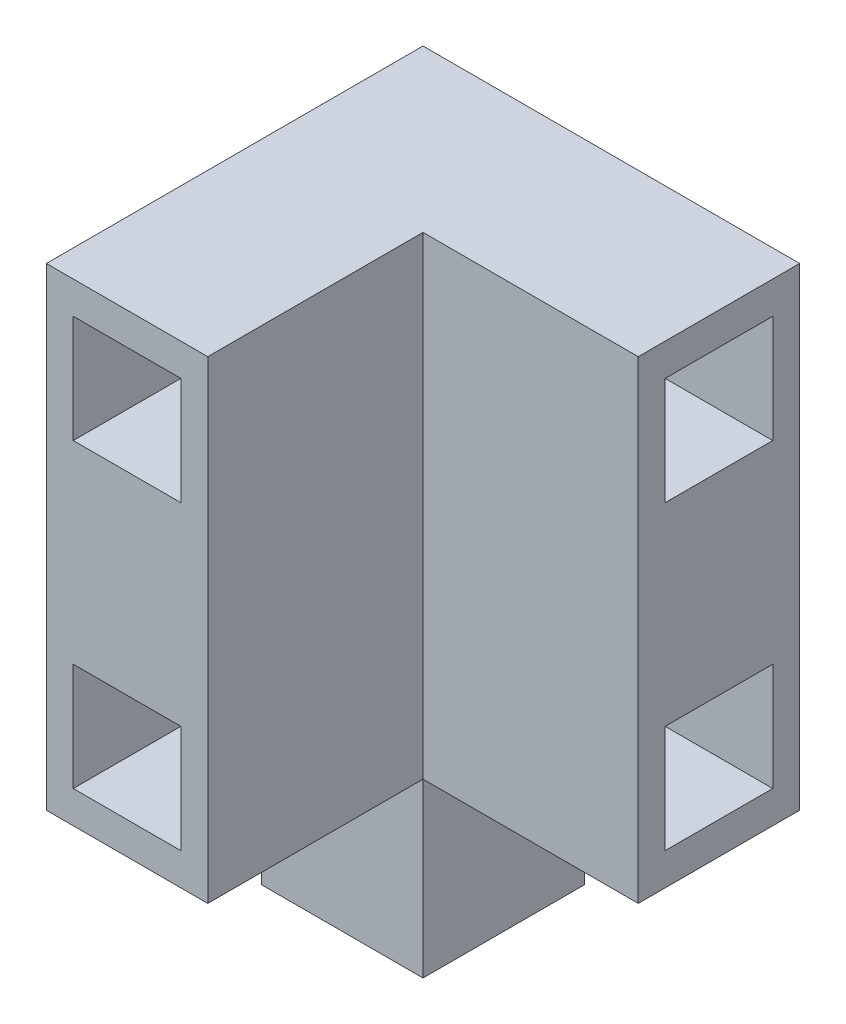
ISO-10303-21;
HEADER;
FILE_DESCRIPTION(('STEP AP214'),'2;1');
FILE_NAME('part.step','',(''),(''),'','','');
FILE_SCHEMA(('AUTOMOTIVE_DESIGN { 1 0 10303 214 1 1 1 1 }'));
ENDSEC;
DATA;
#1=APPLICATION_CONTEXT('core data for automotive mechanical design processes');
#2=APPLICATION_PROTOCOL_DEFINITION('international standard','automotive_design',2000,#1);
#3=PRODUCT_CONTEXT('',#1,'mechanical');
#4=PRODUCT('Part','Part','',(#3));
#5=PRODUCT_RELATED_PRODUCT_CATEGORY('part','',(#4));
#6=PRODUCT_DEFINITION_FORMATION('','',#4);
#7=PRODUCT_DEFINITION_CONTEXT('part definition',#1,'design');
#8=PRODUCT_DEFINITION('design','',#6,#7);
#9=PRODUCT_DEFINITION_SHAPE('','',#8);
#10=(LENGTH_UNIT() NAMED_UNIT(*) SI_UNIT(.MILLI.,.METRE.));
#11=(NAMED_UNIT(*) PLANE_ANGLE_UNIT() SI_UNIT($,.RADIAN.));
#12=(NAMED_UNIT(*) SI_UNIT($,.STERADIAN.) SOLID_ANGLE_UNIT());
#13=UNCERTAINTY_MEASURE_WITH_UNIT(LENGTH_MEASURE(1.E-05),#10,'distance_accuracy_value','');
#14=(GEOMETRIC_REPRESENTATION_CONTEXT(3) GLOBAL_UNCERTAINTY_ASSIGNED_CONTEXT((#13)) GLOBAL_UNIT_ASSIGNED_CONTEXT((#10,
#11,#12)) REPRESENTATION_CONTEXT('',''));
#15=CARTESIAN_POINT('',(0.,0.,0.));
#16=DIRECTION('',(0.,0.,1.));
#17=DIRECTION('',(1.,0.,0.));
#18=AXIS2_PLACEMENT_3D('',#15,#16,#17);
#19=CARTESIAN_POINT('',(5.,19.,-42.5));
#20=DIRECTION('',(1.,0.,0.));
#21=DIRECTION('',(0.,0.,-1.));
#22=AXIS2_PLACEMENT_3D('',#19,#20,#21);
#23=PLANE('',#22);
#24=DIRECTION('',(0.,0.,1.));
#25=VECTOR('',#24,1.);
#26=CARTESIAN_POINT('',(5.,19.,-42.5));
#27=LINE('',#26,#25);
#28=CARTESIAN_POINT('',(5.,19.,-7.5));
#29=VERTEX_POINT('',#28);
#30=CARTESIAN_POINT('',(5.,19.,-5.));
#31=VERTEX_POINT('',#30);
#32=EDGE_CURVE('E401',#29,#31,#27,.T.);
#33=ORIENTED_EDGE('',*,*,#32,.T.);
#34=DIRECTION('',(0.,1.,0.));
#35=VECTOR('',#34,1.);
#36=CARTESIAN_POINT('',(5.,19.,-5.));
#37=LINE('',#36,#35);
#38=CARTESIAN_POINT('',(5.,29.,-5.));
#39=VERTEX_POINT('',#38);
#40=EDGE_CURVE('E346',#31,#39,#37,.T.);
#41=ORIENTED_EDGE('',*,*,#40,.T.);
#42=DIRECTION('',(0.,0.,1.));
#43=VECTOR('',#42,1.);
#44=CARTESIAN_POINT('',(5.,29.,-42.5));
#45=LINE('',#44,#43);
#46=CARTESIAN_POINT('',(5.,29.,-7.5));
#47=VERTEX_POINT('',#46);
#48=EDGE_CURVE('E388',#47,#39,#45,.T.);
#49=ORIENTED_EDGE('',*,*,#48,.F.);
#50=DIRECTION('',(0.,1.,0.));
#51=VECTOR('',#50,1.);
#52=CARTESIAN_POINT('',(5.,60.,-7.5));
#53=LINE('',#52,#51);
#54=EDGE_CURVE('E422',#29,#47,#53,.T.);
#55=ORIENTED_EDGE('',*,*,#54,.F.);
#56=EDGE_LOOP('',(#33,#41,#49,#55));
#57=FACE_BOUND('',#56,.T.);
#58=ADVANCED_FACE('F42',(#57),#23,.F.);
#59=CARTESIAN_POINT('',(-5.,19.,-42.5));
#60=DIRECTION('',(-1.,0.,0.));
#61=DIRECTION('',(0.,0.,1.));
#62=AXIS2_PLACEMENT_3D('',#59,#60,#61);
#63=PLANE('',#62);
#64=DIRECTION('',(0.,0.,1.));
#65=VECTOR('',#64,1.);
#66=CARTESIAN_POINT('',(-5.,29.,-42.5));
#67=LINE('',#66,#65);
#68=CARTESIAN_POINT('',(-5.,29.,-7.5));
#69=VERTEX_POINT('',#68);
#70=CARTESIAN_POINT('',(-5.,29.,-5.));
#71=VERTEX_POINT('',#70);
#72=EDGE_CURVE('E393',#69,#71,#67,.T.);
#73=ORIENTED_EDGE('',*,*,#72,.T.);
#74=DIRECTION('',(0.,-1.,0.));
#75=VECTOR('',#74,1.);
#76=CARTESIAN_POINT('',(-5.,19.,-5.));
#77=LINE('',#76,#75);
#78=CARTESIAN_POINT('',(-5.,19.,-5.));
#79=VERTEX_POINT('',#78);
#80=EDGE_CURVE('E343',#71,#79,#77,.T.);
#81=ORIENTED_EDGE('',*,*,#80,.T.);
#82=DIRECTION('',(0.,0.,1.));
#83=VECTOR('',#82,1.);
#84=CARTESIAN_POINT('',(-5.,19.,-42.5));
#85=LINE('',#84,#83);
#86=CARTESIAN_POINT('',(-5.,19.,-7.5));
#87=VERTEX_POINT('',#86);
#88=EDGE_CURVE('E397',#87,#79,#85,.T.);
#89=ORIENTED_EDGE('',*,*,#88,.F.);
#90=DIRECTION('',(0.,-1.,0.));
#91=VECTOR('',#90,1.);
#92=CARTESIAN_POINT('',(-5.,60.,-7.5));
#93=LINE('',#92,#91);
#94=EDGE_CURVE('E416',#69,#87,#93,.T.);
#95=ORIENTED_EDGE('',*,*,#94,.F.);
#96=EDGE_LOOP('',(#73,#81,#89,#95));
#97=FACE_BOUND('',#96,.T.);
#98=ADVANCED_FACE('F554',(#97),#63,.F.);
#99=CARTESIAN_POINT('',(5.,47.,-42.5));
#100=DIRECTION('',(1.,0.,0.));
#101=DIRECTION('',(0.,0.,-1.));
#102=AXIS2_PLACEMENT_3D('',#99,#100,#101);
#103=PLANE('',#102);
#104=DIRECTION('',(0.,0.,1.));
#105=VECTOR('',#104,1.);
#106=CARTESIAN_POINT('',(5.,47.,-42.5));
#107=LINE('',#106,#105);
#108=CARTESIAN_POINT('',(5.,47.,-7.5));
#109=VERTEX_POINT('',#108);
#110=CARTESIAN_POINT('',(5.,47.,-5.));
#111=VERTEX_POINT('',#110);
#112=EDGE_CURVE('E373',#109,#111,#107,.T.);
#113=ORIENTED_EDGE('',*,*,#112,.T.);
#114=DIRECTION('',(0.,1.,0.));
#115=VECTOR('',#114,1.);
#116=CARTESIAN_POINT('',(5.,47.,-5.));
#117=LINE('',#116,#115);
#118=CARTESIAN_POINT('',(5.,57.,-5.));
#119=VERTEX_POINT('',#118);
#120=EDGE_CURVE('E322',#111,#119,#117,.T.);
#121=ORIENTED_EDGE('',*,*,#120,.T.);
#122=DIRECTION('',(0.,0.,1.));
#123=VECTOR('',#122,1.);
#124=CARTESIAN_POINT('',(5.,57.,-42.5));
#125=LINE('',#124,#123);
#126=CARTESIAN_POINT('',(5.,57.,-7.5));
#127=VERTEX_POINT('',#126);
#128=EDGE_CURVE('E386',#127,#119,#125,.T.);
#129=ORIENTED_EDGE('',*,*,#128,.F.);
#130=DIRECTION('',(0.,1.,0.));
#131=VECTOR('',#130,1.);
#132=CARTESIAN_POINT('',(5.,60.,-7.5));
#133=LINE('',#132,#131);
#134=EDGE_CURVE('E434',#109,#127,#133,.T.);
#135=ORIENTED_EDGE('',*,*,#134,.F.);
#136=EDGE_LOOP('',(#113,#121,#129,#135));
#137=FACE_BOUND('',#136,.T.);
#138=ADVANCED_FACE('F562',(#137),#103,.F.);
#139=CARTESIAN_POINT('',(-5.,47.,-42.5));
#140=DIRECTION('',(-1.,0.,0.));
#141=DIRECTION('',(0.,0.,1.));
#142=AXIS2_PLACEMENT_3D('',#139,#140,#141);
#143=PLANE('',#142);
#144=DIRECTION('',(0.,0.,1.));
#145=VECTOR('',#144,1.);
#146=CARTESIAN_POINT('',(-5.,57.,-42.5));
#147=LINE('',#146,#145);
#148=CARTESIAN_POINT('',(-5.,57.,-7.5));
#149=VERTEX_POINT('',#148);
#150=CARTESIAN_POINT('',(-5.,57.,-5.));
#151=VERTEX_POINT('',#150);
#152=EDGE_CURVE('E382',#149,#151,#147,.T.);
#153=ORIENTED_EDGE('',*,*,#152,.T.);
#154=DIRECTION('',(0.,-1.,0.));
#155=VECTOR('',#154,1.);
#156=CARTESIAN_POINT('',(-5.,47.,-5.));
#157=LINE('',#156,#155);
#158=CARTESIAN_POINT('',(-5.,47.,-5.));
#159=VERTEX_POINT('',#158);
#160=EDGE_CURVE('E319',#151,#159,#157,.T.);
#161=ORIENTED_EDGE('',*,*,#160,.T.);
#162=DIRECTION('',(0.,0.,1.));
#163=VECTOR('',#162,1.);
#164=CARTESIAN_POINT('',(-5.,47.,-42.5));
#165=LINE('',#164,#163);
#166=CARTESIAN_POINT('',(-5.,47.,-7.5));
#167=VERTEX_POINT('',#166);
#168=EDGE_CURVE('E378',#167,#159,#165,.T.);
#169=ORIENTED_EDGE('',*,*,#168,.F.);
#170=DIRECTION('',(0.,-1.,0.));
#171=VECTOR('',#170,1.);
#172=CARTESIAN_POINT('',(-5.,60.,-7.5));
#173=LINE('',#172,#171);
#174=EDGE_CURVE('E428',#149,#167,#173,.T.);
#175=ORIENTED_EDGE('',*,*,#174,.F.);
#176=EDGE_LOOP('',(#153,#161,#169,#175));
#177=FACE_BOUND('',#176,.T.);
#178=ADVANCED_FACE('F552',(#177),#143,.F.);
#179=CARTESIAN_POINT('',(7.5,60.,-7.5));
#180=DIRECTION('',(-1.,0.,0.));
#181=DIRECTION('',(0.,0.,1.));
#182=AXIS2_PLACEMENT_3D('',#179,#180,#181);
#183=PLANE('',#182);
#184=DIRECTION('',(0.,0.,-1.));
#185=VECTOR('',#184,1.);
#186=CARTESIAN_POINT('',(7.5,16.,-7.50000000000001));
#187=LINE('',#186,#185);
#188=CARTESIAN_POINT('',(7.5,16.,7.5));
#189=VERTEX_POINT('',#188);
#190=CARTESIAN_POINT('',(7.5,16.,-7.5));
#191=VERTEX_POINT('',#190);
#192=EDGE_CURVE('E442',#189,#191,#187,.T.);
#193=ORIENTED_EDGE('',*,*,#192,.F.);
#194=DIRECTION('',(0.,-1.,0.));
#195=VECTOR('',#194,1.);
#196=CARTESIAN_POINT('',(7.5,60.,7.5));
#197=LINE('',#196,#195);
#198=CARTESIAN_POINT('',(7.5,0.,7.5));
#199=VERTEX_POINT('',#198);
#200=EDGE_CURVE('E489',#189,#199,#197,.T.);
#201=ORIENTED_EDGE('',*,*,#200,.T.);
#202=DIRECTION('',(0.,0.,-1.));
#203=VECTOR('',#202,1.);
#204=CARTESIAN_POINT('',(7.5,0.,-7.5));
#205=LINE('',#204,#203);
#206=CARTESIAN_POINT('',(7.5,0.,-7.5));
#207=VERTEX_POINT('',#206);
#208=EDGE_CURVE('E480',#199,#207,#205,.T.);
#209=ORIENTED_EDGE('',*,*,#208,.T.);
#210=DIRECTION('',(0.,-1.,0.));
#211=VECTOR('',#210,1.);
#212=CARTESIAN_POINT('',(7.5,60.,-7.5));
#213=LINE('',#212,#211);
#214=EDGE_CURVE('E11',#191,#207,#213,.T.);
#215=ORIENTED_EDGE('',*,*,#214,.F.);
#216=EDGE_LOOP('',(#193,#201,#209,#215));
#217=FACE_BOUND('',#216,.T.);
#218=ADVANCED_FACE('F44',(#217),#183,.F.);
#219=DIRECTION('',(0.,-1.,0.));
#220=VECTOR('',#219,1.);
#221=CARTESIAN_POINT('',(7.5,60.,7.5));
#222=LINE('',#221,#220);
#223=CARTESIAN_POINT('',(7.5,60.,7.5));
#224=VERTEX_POINT('',#223);
#225=EDGE_CURVE('E437',#224,#189,#222,.T.);
#226=ORIENTED_EDGE('',*,*,#225,.F.);
#227=DIRECTION('',(0.,0.,-1.));
#228=VECTOR('',#227,1.);
#229=CARTESIAN_POINT('',(7.5,60.,-7.5));
#230=LINE('',#229,#228);
#231=CARTESIAN_POINT('',(7.5,60.,27.5));
#232=VERTEX_POINT('',#231);
#233=EDGE_CURVE('E481',#232,#224,#230,.T.);
#234=ORIENTED_EDGE('',*,*,#233,.F.);
#235=DIRECTION('',(0.,1.,0.));
#236=VECTOR('',#235,1.);
#237=CARTESIAN_POINT('',(7.5,60.,27.5));
#238=LINE('',#237,#236);
#239=CARTESIAN_POINT('',(7.5,16.,27.5));
#240=VERTEX_POINT('',#239);
#241=EDGE_CURVE('E467',#240,#232,#238,.T.);
#242=ORIENTED_EDGE('',*,*,#241,.F.);
#243=DIRECTION('',(0.,0.,-1.));
#244=VECTOR('',#243,1.);
#245=CARTESIAN_POINT('',(7.5,16.,27.5));
#246=LINE('',#245,#244);
#247=EDGE_CURVE('E473',#240,#189,#246,.T.);
#248=ORIENTED_EDGE('',*,*,#247,.T.);
#249=EDGE_LOOP('',(#226,#234,#242,#248));
#250=FACE_BOUND('',#249,.T.);
#251=ADVANCED_FACE('F544',(#250),#183,.F.);
#252=CARTESIAN_POINT('',(-7.5,60.,7.5));
#253=DIRECTION('',(0.,0.,-1.));
#254=DIRECTION('',(-1.,0.,0.));
#255=AXIS2_PLACEMENT_3D('',#252,#253,#254);
#256=PLANE('',#255);
#257=DIRECTION('',(1.,0.,0.));
#258=VECTOR('',#257,1.);
#259=CARTESIAN_POINT('',(-7.49999999999999,16.,7.5));
#260=LINE('',#259,#258);
#261=CARTESIAN_POINT('',(-7.5,16.,7.5));
#262=VERTEX_POINT('',#261);
#263=EDGE_CURVE('E461',#262,#189,#260,.T.);
#264=ORIENTED_EDGE('',*,*,#263,.F.);
#265=DIRECTION('',(0.,-1.,0.));
#266=VECTOR('',#265,1.);
#267=CARTESIAN_POINT('',(-7.5,60.,7.5));
#268=LINE('',#267,#266);
#269=CARTESIAN_POINT('',(-7.5,0.,7.5));
#270=VERTEX_POINT('',#269);
#271=EDGE_CURVE('E500',#262,#270,#268,.T.);
#272=ORIENTED_EDGE('',*,*,#271,.T.);
#273=DIRECTION('',(1.,0.,0.));
#274=VECTOR('',#273,1.);
#275=CARTESIAN_POINT('',(-7.5,0.,7.5));
#276=LINE('',#275,#274);
#277=EDGE_CURVE('E485',#270,#199,#276,.T.);
#278=ORIENTED_EDGE('',*,*,#277,.T.);
#279=ORIENTED_EDGE('',*,*,#200,.F.);
#280=EDGE_LOOP('',(#264,#272,#278,#279));
#281=FACE_BOUND('',#280,.T.);
#282=ADVANCED_FACE('F517',(#281),#256,.F.);
#283=CARTESIAN_POINT('',(-7.5,60.,-7.5));
#284=DIRECTION('',(0.,0.,1.));
#285=DIRECTION('',(1.,0.,0.));
#286=AXIS2_PLACEMENT_3D('',#283,#284,#285);
#287=PLANE('',#286);
#288=DIRECTION('',(1.,0.,0.));
#289=VECTOR('',#288,1.);
#290=CARTESIAN_POINT('',(-7.5,47.,-7.5));
#291=LINE('',#290,#289);
#292=EDGE_CURVE('E431',#167,#109,#291,.T.);
#293=ORIENTED_EDGE('',*,*,#292,.T.);
#294=ORIENTED_EDGE('',*,*,#134,.T.);
#295=DIRECTION('',(-1.,0.,0.));
#296=VECTOR('',#295,1.);
#297=CARTESIAN_POINT('',(-7.5,57.,-7.5));
#298=LINE('',#297,#296);
#299=EDGE_CURVE('E425',#127,#149,#298,.T.);
#300=ORIENTED_EDGE('',*,*,#299,.T.);
#301=ORIENTED_EDGE('',*,*,#174,.T.);
#302=EDGE_LOOP('',(#293,#294,#300,#301));
#303=FACE_BOUND('',#302,.T.);
#304=DIRECTION('',(1.,0.,0.));
#305=VECTOR('',#304,1.);
#306=CARTESIAN_POINT('',(-7.5,19.,-7.5));
#307=LINE('',#306,#305);
#308=EDGE_CURVE('E419',#87,#29,#307,.T.);
#309=ORIENTED_EDGE('',*,*,#308,.T.);
#310=ORIENTED_EDGE('',*,*,#54,.T.);
#311=DIRECTION('',(-1.,0.,0.));
#312=VECTOR('',#311,1.);
#313=CARTESIAN_POINT('',(-7.5,29.,-7.5));
#314=LINE('',#313,#312);
#315=EDGE_CURVE('E376',#47,#69,#314,.T.);
#316=ORIENTED_EDGE('',*,*,#315,.T.);
#317=ORIENTED_EDGE('',*,*,#94,.T.);
#318=EDGE_LOOP('',(#309,#310,#316,#317));
#319=FACE_BOUND('',#318,.T.);
#320=DIRECTION('',(-1.,0.,0.));
#321=VECTOR('',#320,1.);
#322=CARTESIAN_POINT('',(-7.5,0.,-7.5));
#323=LINE('',#322,#321);
#324=CARTESIAN_POINT('',(-7.5,0.,-7.5));
#325=VERTEX_POINT('',#324);
#326=EDGE_CURVE('E492',#207,#325,#323,.T.);
#327=ORIENTED_EDGE('',*,*,#326,.T.);
#328=DIRECTION('',(0.,-1.,0.));
#329=VECTOR('',#328,1.);
#330=CARTESIAN_POINT('',(-7.5,60.,-7.5));
#331=LINE('',#330,#329);
#332=CARTESIAN_POINT('',(-7.5,60.,-7.5));
#333=VERTEX_POINT('',#332);
#334=EDGE_CURVE('E50',#333,#325,#331,.T.);
#335=ORIENTED_EDGE('',*,*,#334,.F.);
#336=DIRECTION('',(-1.,0.,0.));
#337=VECTOR('',#336,1.);
#338=CARTESIAN_POINT('',(-7.5,60.,-7.5));
#339=LINE('',#338,#337);
#340=CARTESIAN_POINT('',(27.5,60.,-7.50000000000001));
#341=VERTEX_POINT('',#340);
#342=EDGE_CURVE('E484',#341,#333,#339,.T.);
#343=ORIENTED_EDGE('',*,*,#342,.F.);
#344=DIRECTION('',(0.,1.,0.));
#345=VECTOR('',#344,1.);
#346=CARTESIAN_POINT('',(27.5,60.,-7.50000000000001));
#347=LINE('',#346,#345);
#348=CARTESIAN_POINT('',(27.5,16.,-7.50000000000001));
#349=VERTEX_POINT('',#348);
#350=EDGE_CURVE('E438',#349,#341,#347,.T.);
#351=ORIENTED_EDGE('',*,*,#350,.F.);
#352=DIRECTION('',(-1.,0.,0.));
#353=VECTOR('',#352,1.);
#354=CARTESIAN_POINT('',(27.5,16.,-7.50000000000001));
#355=LINE('',#354,#353);
#356=EDGE_CURVE('E448',#349,#191,#355,.T.);
#357=ORIENTED_EDGE('',*,*,#356,.T.);
#358=ORIENTED_EDGE('',*,*,#214,.T.);
#359=EDGE_LOOP('',(#327,#335,#343,#351,#357,#358));
#360=FACE_BOUND('',#359,.T.);
#361=ADVANCED_FACE('F532',(#303,#319,#360),#287,.F.);
#362=CARTESIAN_POINT('',(-7.5,60.,-7.5));
#363=DIRECTION('',(1.,0.,0.));
#364=DIRECTION('',(0.,0.,-1.));
#365=AXIS2_PLACEMENT_3D('',#362,#363,#364);
#366=PLANE('',#365);
#367=DIRECTION('',(0.,0.,-1.));
#368=VECTOR('',#367,1.);
#369=CARTESIAN_POINT('',(-7.5,47.,-7.5));
#370=LINE('',#369,#368);
#371=CARTESIAN_POINT('',(-7.5,47.,5.));
#372=VERTEX_POINT('',#371);
#373=CARTESIAN_POINT('',(-7.5,47.,-5.));
#374=VERTEX_POINT('',#373);
#375=EDGE_CURVE('E331',#372,#374,#370,.T.);
#376=ORIENTED_EDGE('',*,*,#375,.T.);
#377=DIRECTION('',(0.,1.,0.));
#378=VECTOR('',#377,1.);
#379=CARTESIAN_POINT('',(-7.5,60.,-5.));
#380=LINE('',#379,#378);
#381=CARTESIAN_POINT('',(-7.5,57.,-5.));
#382=VERTEX_POINT('',#381);
#383=EDGE_CURVE('E325',#374,#382,#380,.T.);
#384=ORIENTED_EDGE('',*,*,#383,.T.);
#385=DIRECTION('',(0.,0.,1.));
#386=VECTOR('',#385,1.);
#387=CARTESIAN_POINT('',(-7.5,57.,-7.5));
#388=LINE('',#387,#386);
#389=CARTESIAN_POINT('',(-7.5,57.,5.00000000000001));
#390=VERTEX_POINT('',#389);
#391=EDGE_CURVE('E328',#382,#390,#388,.T.);
#392=ORIENTED_EDGE('',*,*,#391,.T.);
#393=DIRECTION('',(0.,-1.,0.));
#394=VECTOR('',#393,1.);
#395=CARTESIAN_POINT('',(-7.5,60.,5.));
#396=LINE('',#395,#394);
#397=EDGE_CURVE('E316',#390,#372,#396,.T.);
#398=ORIENTED_EDGE('',*,*,#397,.T.);
#399=EDGE_LOOP('',(#376,#384,#392,#398));
#400=FACE_BOUND('',#399,.T.);
#401=DIRECTION('',(0.,0.,-1.));
#402=VECTOR('',#401,1.);
#403=CARTESIAN_POINT('',(-7.5,19.,-7.5));
#404=LINE('',#403,#402);
#405=CARTESIAN_POINT('',(-7.5,19.,5.));
#406=VERTEX_POINT('',#405);
#407=CARTESIAN_POINT('',(-7.5,19.,-5.));
#408=VERTEX_POINT('',#407);
#409=EDGE_CURVE('E355',#406,#408,#404,.T.);
#410=ORIENTED_EDGE('',*,*,#409,.T.);
#411=DIRECTION('',(0.,1.,0.));
#412=VECTOR('',#411,1.);
#413=CARTESIAN_POINT('',(-7.5,60.,-4.99999999999999));
#414=LINE('',#413,#412);
#415=CARTESIAN_POINT('',(-7.5,29.,-5.));
#416=VERTEX_POINT('',#415);
#417=EDGE_CURVE('E349',#408,#416,#414,.T.);
#418=ORIENTED_EDGE('',*,*,#417,.T.);
#419=DIRECTION('',(0.,0.,1.));
#420=VECTOR('',#419,1.);
#421=CARTESIAN_POINT('',(-7.5,29.,-7.5));
#422=LINE('',#421,#420);
#423=CARTESIAN_POINT('',(-7.5,29.,5.00000000000001));
#424=VERTEX_POINT('',#423);
#425=EDGE_CURVE('E352',#416,#424,#422,.T.);
#426=ORIENTED_EDGE('',*,*,#425,.T.);
#427=DIRECTION('',(0.,-1.,0.));
#428=VECTOR('',#427,1.);
#429=CARTESIAN_POINT('',(-7.5,60.,5.));
#430=LINE('',#429,#428);
#431=EDGE_CURVE('E340',#424,#406,#430,.T.);
#432=ORIENTED_EDGE('',*,*,#431,.T.);
#433=EDGE_LOOP('',(#410,#418,#426,#432));
#434=FACE_BOUND('',#433,.T.);
#435=DIRECTION('',(0.,0.,1.));
#436=VECTOR('',#435,1.);
#437=CARTESIAN_POINT('',(-7.5,0.,-7.5));
#438=LINE('',#437,#436);
#439=EDGE_CURVE('E494',#325,#270,#438,.T.);
#440=ORIENTED_EDGE('',*,*,#439,.T.);
#441=ORIENTED_EDGE('',*,*,#271,.F.);
#442=DIRECTION('',(0.,0.,-1.));
#443=VECTOR('',#442,1.);
#444=CARTESIAN_POINT('',(-7.49999999999999,16.,27.5));
#445=LINE('',#444,#443);
#446=CARTESIAN_POINT('',(-7.49999999999999,16.,27.5));
#447=VERTEX_POINT('',#446);
#448=EDGE_CURVE('E477',#447,#262,#445,.T.);
#449=ORIENTED_EDGE('',*,*,#448,.F.);
#450=DIRECTION('',(0.,-1.,0.));
#451=VECTOR('',#450,1.);
#452=CARTESIAN_POINT('',(-7.5,60.,27.5));
#453=LINE('',#452,#451);
#454=CARTESIAN_POINT('',(-7.5,60.,27.5));
#455=VERTEX_POINT('',#454);
#456=EDGE_CURVE('E462',#455,#447,#453,.T.);
#457=ORIENTED_EDGE('',*,*,#456,.F.);
#458=DIRECTION('',(0.,0.,1.));
#459=VECTOR('',#458,1.);
#460=CARTESIAN_POINT('',(-7.5,60.,-7.5));
#461=LINE('',#460,#459);
#462=EDGE_CURVE('E487',#333,#455,#461,.T.);
#463=ORIENTED_EDGE('',*,*,#462,.F.);
#464=ORIENTED_EDGE('',*,*,#334,.T.);
#465=EDGE_LOOP('',(#440,#441,#449,#457,#463,#464));
#466=FACE_BOUND('',#465,.T.);
#467=ADVANCED_FACE('F506',(#400,#434,#466),#366,.F.);
#468=CARTESIAN_POINT('',(0.,60.,0.));
#469=DIRECTION('',(0.,1.,0.));
#470=DIRECTION('',(0.,0.,1.));
#471=AXIS2_PLACEMENT_3D('',#468,#469,#470);
#472=PLANE('',#471);
#473=ORIENTED_EDGE('',*,*,#233,.T.);
#474=DIRECTION('',(-1.,0.,0.));
#475=VECTOR('',#474,1.);
#476=CARTESIAN_POINT('',(27.5,60.,7.5));
#477=LINE('',#476,#475);
#478=CARTESIAN_POINT('',(27.5,60.,7.5));
#479=VERTEX_POINT('',#478);
#480=EDGE_CURVE('E458',#479,#224,#477,.T.);
#481=ORIENTED_EDGE('',*,*,#480,.F.);
#482=DIRECTION('',(0.,0.,1.));
#483=VECTOR('',#482,1.);
#484=CARTESIAN_POINT('',(27.5,60.,-7.50000000000001));
#485=LINE('',#484,#483);
#486=EDGE_CURVE('E441',#341,#479,#485,.T.);
#487=ORIENTED_EDGE('',*,*,#486,.F.);
#488=ORIENTED_EDGE('',*,*,#342,.T.);
#489=ORIENTED_EDGE('',*,*,#462,.T.);
#490=DIRECTION('',(-1.,0.,0.));
#491=VECTOR('',#490,1.);
#492=CARTESIAN_POINT('',(-7.5,60.,27.5));
#493=LINE('',#492,#491);
#494=EDGE_CURVE('E470',#232,#455,#493,.T.);
#495=ORIENTED_EDGE('',*,*,#494,.F.);
#496=EDGE_LOOP('',(#473,#481,#487,#488,#489,#495));
#497=FACE_BOUND('',#496,.T.);
#498=ADVANCED_FACE('F528',(#497),#472,.T.);
#499=CARTESIAN_POINT('',(0.,0.,0.));
#500=DIRECTION('',(0.,1.,0.));
#501=DIRECTION('',(0.,0.,1.));
#502=AXIS2_PLACEMENT_3D('',#499,#500,#501);
#503=PLANE('',#502);
#504=ORIENTED_EDGE('',*,*,#208,.F.);
#505=ORIENTED_EDGE('',*,*,#277,.F.);
#506=ORIENTED_EDGE('',*,*,#439,.F.);
#507=ORIENTED_EDGE('',*,*,#326,.F.);
#508=EDGE_LOOP('',(#504,#505,#506,#507));
#509=FACE_BOUND('',#508,.T.);
#510=ADVANCED_FACE('F514',(#509),#503,.F.);
#511=CARTESIAN_POINT('',(-7.49999999999999,16.,27.5));
#512=DIRECTION('',(0.,1.,0.));
#513=DIRECTION('',(0.,0.,1.));
#514=AXIS2_PLACEMENT_3D('',#511,#512,#513);
#515=PLANE('',#514);
#516=ORIENTED_EDGE('',*,*,#263,.T.);
#517=ORIENTED_EDGE('',*,*,#247,.F.);
#518=DIRECTION('',(1.,0.,0.));
#519=VECTOR('',#518,1.);
#520=CARTESIAN_POINT('',(-7.49999999999999,16.,27.5));
#521=LINE('',#520,#519);
#522=EDGE_CURVE('E465',#447,#240,#521,.T.);
#523=ORIENTED_EDGE('',*,*,#522,.F.);
#524=ORIENTED_EDGE('',*,*,#448,.T.);
#525=EDGE_LOOP('',(#516,#517,#523,#524));
#526=FACE_BOUND('',#525,.T.);
#527=ADVANCED_FACE('F521',(#526),#515,.F.);
#528=CARTESIAN_POINT('',(0.,0.,27.5));
#529=DIRECTION('',(0.,0.,1.));
#530=DIRECTION('',(1.,0.,0.));
#531=AXIS2_PLACEMENT_3D('',#528,#529,#530);
#532=PLANE('',#531);
#533=DIRECTION('',(0.,1.,0.));
#534=VECTOR('',#533,1.);
#535=CARTESIAN_POINT('',(5.,47.,27.5));
#536=LINE('',#535,#534);
#537=CARTESIAN_POINT('',(5.,47.,27.5));
#538=VERTEX_POINT('',#537);
#539=CARTESIAN_POINT('',(5.,57.,27.5));
#540=VERTEX_POINT('',#539);
#541=EDGE_CURVE('E359',#538,#540,#536,.T.);
#542=ORIENTED_EDGE('',*,*,#541,.F.);
#543=DIRECTION('',(1.,0.,0.));
#544=VECTOR('',#543,1.);
#545=CARTESIAN_POINT('',(-5.,47.,27.5));
#546=LINE('',#545,#544);
#547=CARTESIAN_POINT('',(-5.,47.,27.5));
#548=VERTEX_POINT('',#547);
#549=EDGE_CURVE('E369',#548,#538,#546,.T.);
#550=ORIENTED_EDGE('',*,*,#549,.F.);
#551=DIRECTION('',(0.,-1.,0.));
#552=VECTOR('',#551,1.);
#553=CARTESIAN_POINT('',(-5.,47.,27.5));
#554=LINE('',#553,#552);
#555=CARTESIAN_POINT('',(-5.,57.,27.5));
#556=VERTEX_POINT('',#555);
#557=EDGE_CURVE('E366',#556,#548,#554,.T.);
#558=ORIENTED_EDGE('',*,*,#557,.F.);
#559=DIRECTION('',(-1.,0.,0.));
#560=VECTOR('',#559,1.);
#561=CARTESIAN_POINT('',(-5.,57.,27.5));
#562=LINE('',#561,#560);
#563=EDGE_CURVE('E362',#540,#556,#562,.T.);
#564=ORIENTED_EDGE('',*,*,#563,.F.);
#565=EDGE_LOOP('',(#542,#550,#558,#564));
#566=FACE_BOUND('',#565,.T.);
#567=DIRECTION('',(0.,1.,0.));
#568=VECTOR('',#567,1.);
#569=CARTESIAN_POINT('',(5.,19.,27.5));
#570=LINE('',#569,#568);
#571=CARTESIAN_POINT('',(5.,19.,27.5));
#572=VERTEX_POINT('',#571);
#573=CARTESIAN_POINT('',(5.,29.,27.5));
#574=VERTEX_POINT('',#573);
#575=EDGE_CURVE('E363',#572,#574,#570,.T.);
#576=ORIENTED_EDGE('',*,*,#575,.F.);
#577=DIRECTION('',(1.,0.,0.));
#578=VECTOR('',#577,1.);
#579=CARTESIAN_POINT('',(-5.,19.,27.5));
#580=LINE('',#579,#578);
#581=CARTESIAN_POINT('',(-5.,19.,27.5));
#582=VERTEX_POINT('',#581);
#583=EDGE_CURVE('E391',#582,#572,#580,.T.);
#584=ORIENTED_EDGE('',*,*,#583,.F.);
#585=DIRECTION('',(0.,-1.,0.));
#586=VECTOR('',#585,1.);
#587=CARTESIAN_POINT('',(-5.,19.,27.5));
#588=LINE('',#587,#586);
#589=CARTESIAN_POINT('',(-5.,29.,27.5));
#590=VERTEX_POINT('',#589);
#591=EDGE_CURVE('E406',#590,#582,#588,.T.);
#592=ORIENTED_EDGE('',*,*,#591,.F.);
#593=DIRECTION('',(-1.,0.,0.));
#594=VECTOR('',#593,1.);
#595=CARTESIAN_POINT('',(-5.,29.,27.5));
#596=LINE('',#595,#594);
#597=EDGE_CURVE('E409',#574,#590,#596,.T.);
#598=ORIENTED_EDGE('',*,*,#597,.F.);
#599=EDGE_LOOP('',(#576,#584,#592,#598));
#600=FACE_BOUND('',#599,.T.);
#601=ORIENTED_EDGE('',*,*,#456,.T.);
#602=ORIENTED_EDGE('',*,*,#522,.T.);
#603=ORIENTED_EDGE('',*,*,#241,.T.);
#604=ORIENTED_EDGE('',*,*,#494,.T.);
#605=EDGE_LOOP('',(#601,#602,#603,#604));
#606=FACE_BOUND('',#605,.T.);
#607=ADVANCED_FACE('F525',(#566,#600,#606),#532,.T.);
#608=CARTESIAN_POINT('',(27.5,60.,7.5));
#609=DIRECTION('',(0.,0.,-1.));
#610=DIRECTION('',(-1.,0.,0.));
#611=AXIS2_PLACEMENT_3D('',#608,#609,#610);
#612=PLANE('',#611);
#613=ORIENTED_EDGE('',*,*,#225,.T.);
#614=DIRECTION('',(-1.,0.,0.));
#615=VECTOR('',#614,1.);
#616=CARTESIAN_POINT('',(27.5,16.,7.49999999999999));
#617=LINE('',#616,#615);
#618=CARTESIAN_POINT('',(27.5,16.,7.49999999999999));
#619=VERTEX_POINT('',#618);
#620=EDGE_CURVE('E455',#619,#189,#617,.T.);
#621=ORIENTED_EDGE('',*,*,#620,.F.);
#622=DIRECTION('',(0.,-1.,0.));
#623=VECTOR('',#622,1.);
#624=CARTESIAN_POINT('',(27.5,60.,7.5));
#625=LINE('',#624,#623);
#626=EDGE_CURVE('E444',#479,#619,#625,.T.);
#627=ORIENTED_EDGE('',*,*,#626,.F.);
#628=ORIENTED_EDGE('',*,*,#480,.T.);
#629=EDGE_LOOP('',(#613,#621,#627,#628));
#630=FACE_BOUND('',#629,.T.);
#631=ADVANCED_FACE('F542',(#630),#612,.F.);
#632=CARTESIAN_POINT('',(27.5,16.,-7.50000000000001));
#633=DIRECTION('',(0.,1.,0.));
#634=DIRECTION('',(0.,0.,1.));
#635=AXIS2_PLACEMENT_3D('',#632,#633,#634);
#636=PLANE('',#635);
#637=ORIENTED_EDGE('',*,*,#192,.T.);
#638=ORIENTED_EDGE('',*,*,#356,.F.);
#639=DIRECTION('',(0.,0.,-1.));
#640=VECTOR('',#639,1.);
#641=CARTESIAN_POINT('',(27.5,16.,-7.50000000000001));
#642=LINE('',#641,#640);
#643=EDGE_CURVE('E446',#619,#349,#642,.T.);
#644=ORIENTED_EDGE('',*,*,#643,.F.);
#645=ORIENTED_EDGE('',*,*,#620,.T.);
#646=EDGE_LOOP('',(#637,#638,#644,#645));
#647=FACE_BOUND('',#646,.T.);
#648=ADVANCED_FACE('F539',(#647),#636,.F.);
#649=CARTESIAN_POINT('',(27.5,0.,0.));
#650=DIRECTION('',(-1.,0.,0.));
#651=DIRECTION('',(0.,0.,1.));
#652=AXIS2_PLACEMENT_3D('',#649,#650,#651);
#653=PLANE('',#652);
#654=DIRECTION('',(0.,0.,1.));
#655=VECTOR('',#654,1.);
#656=CARTESIAN_POINT('',(27.5,57.,4.99999999999999));
#657=LINE('',#656,#655);
#658=CARTESIAN_POINT('',(27.5,57.,-5.00000000000001));
#659=VERTEX_POINT('',#658);
#660=CARTESIAN_POINT('',(27.5,57.,4.99999999999999));
#661=VERTEX_POINT('',#660);
#662=EDGE_CURVE('E266',#659,#661,#657,.T.);
#663=ORIENTED_EDGE('',*,*,#662,.F.);
#664=DIRECTION('',(0.,1.,0.));
#665=VECTOR('',#664,1.);
#666=CARTESIAN_POINT('',(27.5,57.,-5.00000000000001));
#667=LINE('',#666,#665);
#668=CARTESIAN_POINT('',(27.5,47.,-5.00000000000001));
#669=VERTEX_POINT('',#668);
#670=EDGE_CURVE('E272',#669,#659,#667,.T.);
#671=ORIENTED_EDGE('',*,*,#670,.F.);
#672=DIRECTION('',(0.,0.,-1.));
#673=VECTOR('',#672,1.);
#674=CARTESIAN_POINT('',(27.5,47.,4.99999999999999));
#675=LINE('',#674,#673);
#676=CARTESIAN_POINT('',(27.5,47.,4.99999999999999));
#677=VERTEX_POINT('',#676);
#678=EDGE_CURVE('E277',#677,#669,#675,.T.);
#679=ORIENTED_EDGE('',*,*,#678,.F.);
#680=DIRECTION('',(0.,-1.,0.));
#681=VECTOR('',#680,1.);
#682=CARTESIAN_POINT('',(27.5,57.,4.99999999999999));
#683=LINE('',#682,#681);
#684=EDGE_CURVE('E257',#661,#677,#683,.T.);
#685=ORIENTED_EDGE('',*,*,#684,.F.);
#686=EDGE_LOOP('',(#663,#671,#679,#685));
#687=FACE_BOUND('',#686,.T.);
#688=DIRECTION('',(0.,0.,1.));
#689=VECTOR('',#688,1.);
#690=CARTESIAN_POINT('',(27.5,29.,4.99999999999999));
#691=LINE('',#690,#689);
#692=CARTESIAN_POINT('',(27.5,29.,-5.00000000000001));
#693=VERTEX_POINT('',#692);
#694=CARTESIAN_POINT('',(27.5,29.,4.99999999999999));
#695=VERTEX_POINT('',#694);
#696=EDGE_CURVE('E307',#693,#695,#691,.T.);
#697=ORIENTED_EDGE('',*,*,#696,.F.);
#698=DIRECTION('',(0.,1.,0.));
#699=VECTOR('',#698,1.);
#700=CARTESIAN_POINT('',(27.5,29.,-5.00000000000001));
#701=LINE('',#700,#699);
#702=CARTESIAN_POINT('',(27.5,19.,-5.00000000000001));
#703=VERTEX_POINT('',#702);
#704=EDGE_CURVE('E310',#703,#693,#701,.T.);
#705=ORIENTED_EDGE('',*,*,#704,.F.);
#706=DIRECTION('',(0.,0.,-1.));
#707=VECTOR('',#706,1.);
#708=CARTESIAN_POINT('',(27.5,19.,4.99999999999999));
#709=LINE('',#708,#707);
#710=CARTESIAN_POINT('',(27.5,19.,4.99999999999999));
#711=VERTEX_POINT('',#710);
#712=EDGE_CURVE('E301',#711,#703,#709,.T.);
#713=ORIENTED_EDGE('',*,*,#712,.F.);
#714=DIRECTION('',(0.,-1.,0.));
#715=VECTOR('',#714,1.);
#716=CARTESIAN_POINT('',(27.5,29.,4.99999999999999));
#717=LINE('',#716,#715);
#718=EDGE_CURVE('E304',#695,#711,#717,.T.);
#719=ORIENTED_EDGE('',*,*,#718,.F.);
#720=EDGE_LOOP('',(#697,#705,#713,#719));
#721=FACE_BOUND('',#720,.T.);
#722=ORIENTED_EDGE('',*,*,#350,.T.);
#723=ORIENTED_EDGE('',*,*,#486,.T.);
#724=ORIENTED_EDGE('',*,*,#626,.T.);
#725=ORIENTED_EDGE('',*,*,#643,.T.);
#726=EDGE_LOOP('',(#722,#723,#724,#725));
#727=FACE_BOUND('',#726,.T.);
#728=ADVANCED_FACE('F274',(#687,#721,#727),#653,.F.);
#729=CARTESIAN_POINT('',(5.,29.,5.));
#730=VERTEX_POINT('',#729);
#731=EDGE_CURVE('E392',#730,#574,#45,.T.);
#732=ORIENTED_EDGE('',*,*,#731,.F.);
#733=DIRECTION('',(0.,-1.,0.));
#734=VECTOR('',#733,1.);
#735=CARTESIAN_POINT('',(5.,19.,5.));
#736=LINE('',#735,#734);
#737=CARTESIAN_POINT('',(5.,19.,5.));
#738=VERTEX_POINT('',#737);
#739=EDGE_CURVE('E337',#730,#738,#736,.T.);
#740=ORIENTED_EDGE('',*,*,#739,.T.);
#741=EDGE_CURVE('E358',#738,#572,#27,.T.);
#742=ORIENTED_EDGE('',*,*,#741,.T.);
#743=ORIENTED_EDGE('',*,*,#575,.T.);
#744=EDGE_LOOP('',(#732,#740,#742,#743));
#745=FACE_BOUND('',#744,.T.);
#746=ADVANCED_FACE('F557',(#745),#23,.F.);
#747=CARTESIAN_POINT('',(-5.,19.,-42.5));
#748=DIRECTION('',(0.,-1.,0.));
#749=DIRECTION('',(0.,0.,-1.));
#750=AXIS2_PLACEMENT_3D('',#747,#748,#749);
#751=PLANE('',#750);
#752=ORIENTED_EDGE('',*,*,#741,.F.);
#753=DIRECTION('',(1.,0.,0.));
#754=VECTOR('',#753,1.);
#755=CARTESIAN_POINT('',(-42.5,19.,5.00000000000001));
#756=LINE('',#755,#754);
#757=EDGE_CURVE('E296',#738,#711,#756,.T.);
#758=ORIENTED_EDGE('',*,*,#757,.T.);
#759=ORIENTED_EDGE('',*,*,#712,.T.);
#760=DIRECTION('',(1.,0.,0.));
#761=VECTOR('',#760,1.);
#762=CARTESIAN_POINT('',(-42.5,19.,-4.99999999999999));
#763=LINE('',#762,#761);
#764=EDGE_CURVE('E299',#31,#703,#763,.T.);
#765=ORIENTED_EDGE('',*,*,#764,.F.);
#766=ORIENTED_EDGE('',*,*,#32,.F.);
#767=ORIENTED_EDGE('',*,*,#308,.F.);
#768=ORIENTED_EDGE('',*,*,#88,.T.);
#769=EDGE_CURVE('E298',#408,#79,#763,.T.);
#770=ORIENTED_EDGE('',*,*,#769,.F.);
#771=ORIENTED_EDGE('',*,*,#409,.F.);
#772=CARTESIAN_POINT('',(-5.,19.,5.));
#773=VERTEX_POINT('',#772);
#774=EDGE_CURVE('E295',#406,#773,#756,.T.);
#775=ORIENTED_EDGE('',*,*,#774,.T.);
#776=EDGE_CURVE('E400',#773,#582,#85,.T.);
#777=ORIENTED_EDGE('',*,*,#776,.T.);
#778=ORIENTED_EDGE('',*,*,#583,.T.);
#779=EDGE_LOOP('',(#752,#758,#759,#765,#766,#767,#768,#770,#771,#775,#777,#778));
#780=FACE_BOUND('',#779,.T.);
#781=ADVANCED_FACE('F569',(#780),#751,.F.);
#782=ORIENTED_EDGE('',*,*,#776,.F.);
#783=DIRECTION('',(0.,1.,0.));
#784=VECTOR('',#783,1.);
#785=CARTESIAN_POINT('',(-5.,19.,5.));
#786=LINE('',#785,#784);
#787=CARTESIAN_POINT('',(-5.,29.,5.));
#788=VERTEX_POINT('',#787);
#789=EDGE_CURVE('E334',#773,#788,#786,.T.);
#790=ORIENTED_EDGE('',*,*,#789,.T.);
#791=EDGE_CURVE('E396',#788,#590,#67,.T.);
#792=ORIENTED_EDGE('',*,*,#791,.T.);
#793=ORIENTED_EDGE('',*,*,#591,.T.);
#794=EDGE_LOOP('',(#782,#790,#792,#793));
#795=FACE_BOUND('',#794,.T.);
#796=ADVANCED_FACE('F565',(#795),#63,.F.);
#797=CARTESIAN_POINT('',(-5.,29.,-42.5));
#798=DIRECTION('',(0.,1.,0.));
#799=DIRECTION('',(0.,0.,1.));
#800=AXIS2_PLACEMENT_3D('',#797,#798,#799);
#801=PLANE('',#800);
#802=ORIENTED_EDGE('',*,*,#791,.F.);
#803=DIRECTION('',(1.,0.,0.));
#804=VECTOR('',#803,1.);
#805=CARTESIAN_POINT('',(-42.5,29.,5.00000000000001));
#806=LINE('',#805,#804);
#807=EDGE_CURVE('E65',#424,#788,#806,.T.);
#808=ORIENTED_EDGE('',*,*,#807,.F.);
#809=ORIENTED_EDGE('',*,*,#425,.F.);
#810=DIRECTION('',(1.,0.,0.));
#811=VECTOR('',#810,1.);
#812=CARTESIAN_POINT('',(-42.5,29.,-4.99999999999999));
#813=LINE('',#812,#811);
#814=EDGE_CURVE('E292',#416,#71,#813,.T.);
#815=ORIENTED_EDGE('',*,*,#814,.T.);
#816=ORIENTED_EDGE('',*,*,#72,.F.);
#817=ORIENTED_EDGE('',*,*,#315,.F.);
#818=ORIENTED_EDGE('',*,*,#48,.T.);
#819=EDGE_CURVE('E289',#39,#693,#813,.T.);
#820=ORIENTED_EDGE('',*,*,#819,.T.);
#821=ORIENTED_EDGE('',*,*,#696,.T.);
#822=EDGE_CURVE('E293',#730,#695,#806,.T.);
#823=ORIENTED_EDGE('',*,*,#822,.F.);
#824=ORIENTED_EDGE('',*,*,#731,.T.);
#825=ORIENTED_EDGE('',*,*,#597,.T.);
#826=EDGE_LOOP('',(#802,#808,#809,#815,#816,#817,#818,#820,#821,#823,#824,#825));
#827=FACE_BOUND('',#826,.T.);
#828=ADVANCED_FACE('F583',(#827),#801,.F.);
#829=CARTESIAN_POINT('',(5.,57.,5.));
#830=VERTEX_POINT('',#829);
#831=EDGE_CURVE('E372',#830,#540,#125,.T.);
#832=ORIENTED_EDGE('',*,*,#831,.F.);
#833=DIRECTION('',(0.,-1.,0.));
#834=VECTOR('',#833,1.);
#835=CARTESIAN_POINT('',(5.,47.,5.));
#836=LINE('',#835,#834);
#837=CARTESIAN_POINT('',(5.,47.,5.));
#838=VERTEX_POINT('',#837);
#839=EDGE_CURVE('E260',#830,#838,#836,.T.);
#840=ORIENTED_EDGE('',*,*,#839,.T.);
#841=EDGE_CURVE('E377',#838,#538,#107,.T.);
#842=ORIENTED_EDGE('',*,*,#841,.T.);
#843=ORIENTED_EDGE('',*,*,#541,.T.);
#844=EDGE_LOOP('',(#832,#840,#842,#843));
#845=FACE_BOUND('',#844,.T.);
#846=ADVANCED_FACE('F629',(#845),#103,.F.);
#847=CARTESIAN_POINT('',(-5.,47.,-42.5));
#848=DIRECTION('',(0.,-1.,0.));
#849=DIRECTION('',(0.,0.,-1.));
#850=AXIS2_PLACEMENT_3D('',#847,#848,#849);
#851=PLANE('',#850);
#852=ORIENTED_EDGE('',*,*,#841,.F.);
#853=DIRECTION('',(1.,0.,0.));
#854=VECTOR('',#853,1.);
#855=CARTESIAN_POINT('',(-42.5,47.,5.00000000000001));
#856=LINE('',#855,#854);
#857=EDGE_CURVE('E286',#838,#677,#856,.T.);
#858=ORIENTED_EDGE('',*,*,#857,.T.);
#859=ORIENTED_EDGE('',*,*,#678,.T.);
#860=DIRECTION('',(1.,0.,0.));
#861=VECTOR('',#860,1.);
#862=CARTESIAN_POINT('',(-42.5,47.,-4.99999999999999));
#863=LINE('',#862,#861);
#864=EDGE_CURVE('E282',#111,#669,#863,.T.);
#865=ORIENTED_EDGE('',*,*,#864,.F.);
#866=ORIENTED_EDGE('',*,*,#112,.F.);
#867=ORIENTED_EDGE('',*,*,#292,.F.);
#868=ORIENTED_EDGE('',*,*,#168,.T.);
#869=EDGE_CURVE('E284',#374,#159,#863,.T.);
#870=ORIENTED_EDGE('',*,*,#869,.F.);
#871=ORIENTED_EDGE('',*,*,#375,.F.);
#872=CARTESIAN_POINT('',(-5.,47.,5.));
#873=VERTEX_POINT('',#872);
#874=EDGE_CURVE('E285',#372,#873,#856,.T.);
#875=ORIENTED_EDGE('',*,*,#874,.T.);
#876=EDGE_CURVE('E381',#873,#548,#165,.T.);
#877=ORIENTED_EDGE('',*,*,#876,.T.);
#878=ORIENTED_EDGE('',*,*,#549,.T.);
#879=EDGE_LOOP('',(#852,#858,#859,#865,#866,#867,#868,#870,#871,#875,#877,#878));
#880=FACE_BOUND('',#879,.T.);
#881=ADVANCED_FACE('F625',(#880),#851,.F.);
#882=ORIENTED_EDGE('',*,*,#876,.F.);
#883=DIRECTION('',(0.,1.,0.));
#884=VECTOR('',#883,1.);
#885=CARTESIAN_POINT('',(-5.,47.,5.));
#886=LINE('',#885,#884);
#887=CARTESIAN_POINT('',(-5.,57.,5.));
#888=VERTEX_POINT('',#887);
#889=EDGE_CURVE('E312',#873,#888,#886,.T.);
#890=ORIENTED_EDGE('',*,*,#889,.T.);
#891=EDGE_CURVE('E385',#888,#556,#147,.T.);
#892=ORIENTED_EDGE('',*,*,#891,.T.);
#893=ORIENTED_EDGE('',*,*,#557,.T.);
#894=EDGE_LOOP('',(#882,#890,#892,#893));
#895=FACE_BOUND('',#894,.T.);
#896=ADVANCED_FACE('F628',(#895),#143,.F.);
#897=CARTESIAN_POINT('',(-5.,57.,-42.5));
#898=DIRECTION('',(0.,1.,0.));
#899=DIRECTION('',(0.,0.,1.));
#900=AXIS2_PLACEMENT_3D('',#897,#898,#899);
#901=PLANE('',#900);
#902=ORIENTED_EDGE('',*,*,#891,.F.);
#903=DIRECTION('',(1.,0.,0.));
#904=VECTOR('',#903,1.);
#905=CARTESIAN_POINT('',(-42.5,57.,5.00000000000001));
#906=LINE('',#905,#904);
#907=EDGE_CURVE('E57',#390,#888,#906,.T.);
#908=ORIENTED_EDGE('',*,*,#907,.F.);
#909=ORIENTED_EDGE('',*,*,#391,.F.);
#910=DIRECTION('',(1.,0.,0.));
#911=VECTOR('',#910,1.);
#912=CARTESIAN_POINT('',(-42.5,57.,-4.99999999999999));
#913=LINE('',#912,#911);
#914=EDGE_CURVE('E262',#382,#151,#913,.T.);
#915=ORIENTED_EDGE('',*,*,#914,.T.);
#916=ORIENTED_EDGE('',*,*,#152,.F.);
#917=ORIENTED_EDGE('',*,*,#299,.F.);
#918=ORIENTED_EDGE('',*,*,#128,.T.);
#919=EDGE_CURVE('E269',#119,#659,#913,.T.);
#920=ORIENTED_EDGE('',*,*,#919,.T.);
#921=ORIENTED_EDGE('',*,*,#662,.T.);
#922=EDGE_CURVE('E253',#830,#661,#906,.T.);
#923=ORIENTED_EDGE('',*,*,#922,.F.);
#924=ORIENTED_EDGE('',*,*,#831,.T.);
#925=ORIENTED_EDGE('',*,*,#563,.T.);
#926=EDGE_LOOP('',(#902,#908,#909,#915,#916,#917,#918,#920,#921,#923,#924,#925));
#927=FACE_BOUND('',#926,.T.);
#928=ADVANCED_FACE('F267',(#927),#901,.F.);
#929=CARTESIAN_POINT('',(-42.5,57.,5.00000000000001));
#930=DIRECTION('',(0.,0.,1.));
#931=DIRECTION('',(1.,0.,0.));
#932=AXIS2_PLACEMENT_3D('',#929,#930,#931);
#933=PLANE('',#932);
#934=ORIENTED_EDGE('',*,*,#907,.T.);
#935=ORIENTED_EDGE('',*,*,#889,.F.);
#936=ORIENTED_EDGE('',*,*,#874,.F.);
#937=ORIENTED_EDGE('',*,*,#397,.F.);
#938=EDGE_LOOP('',(#934,#935,#936,#937));
#939=FACE_BOUND('',#938,.T.);
#940=ADVANCED_FACE('F635',(#939),#933,.F.);
#941=CARTESIAN_POINT('',(-42.5,57.,-4.99999999999999));
#942=DIRECTION('',(0.,0.,-1.));
#943=DIRECTION('',(-1.,0.,0.));
#944=AXIS2_PLACEMENT_3D('',#941,#942,#943);
#945=PLANE('',#944);
#946=ORIENTED_EDGE('',*,*,#869,.T.);
#947=ORIENTED_EDGE('',*,*,#160,.F.);
#948=ORIENTED_EDGE('',*,*,#914,.F.);
#949=ORIENTED_EDGE('',*,*,#383,.F.);
#950=EDGE_LOOP('',(#946,#947,#948,#949));
#951=FACE_BOUND('',#950,.T.);
#952=ADVANCED_FACE('F621',(#951),#945,.F.);
#953=ORIENTED_EDGE('',*,*,#864,.T.);
#954=ORIENTED_EDGE('',*,*,#670,.T.);
#955=ORIENTED_EDGE('',*,*,#919,.F.);
#956=ORIENTED_EDGE('',*,*,#120,.F.);
#957=EDGE_LOOP('',(#953,#954,#955,#956));
#958=FACE_BOUND('',#957,.T.);
#959=ADVANCED_FACE('F668',(#958),#945,.F.);
#960=ORIENTED_EDGE('',*,*,#922,.T.);
#961=ORIENTED_EDGE('',*,*,#684,.T.);
#962=ORIENTED_EDGE('',*,*,#857,.F.);
#963=ORIENTED_EDGE('',*,*,#839,.F.);
#964=EDGE_LOOP('',(#960,#961,#962,#963));
#965=FACE_BOUND('',#964,.T.);
#966=ADVANCED_FACE('F255',(#965),#933,.F.);
#967=CARTESIAN_POINT('',(-42.5,29.,5.00000000000001));
#968=DIRECTION('',(0.,0.,1.));
#969=DIRECTION('',(1.,0.,0.));
#970=AXIS2_PLACEMENT_3D('',#967,#968,#969);
#971=PLANE('',#970);
#972=ORIENTED_EDGE('',*,*,#807,.T.);
#973=ORIENTED_EDGE('',*,*,#789,.F.);
#974=ORIENTED_EDGE('',*,*,#774,.F.);
#975=ORIENTED_EDGE('',*,*,#431,.F.);
#976=EDGE_LOOP('',(#972,#973,#974,#975));
#977=FACE_BOUND('',#976,.T.);
#978=ADVANCED_FACE('F599',(#977),#971,.F.);
#979=CARTESIAN_POINT('',(-42.5,29.,-4.99999999999999));
#980=DIRECTION('',(0.,0.,-1.));
#981=DIRECTION('',(-1.,0.,0.));
#982=AXIS2_PLACEMENT_3D('',#979,#980,#981);
#983=PLANE('',#982);
#984=ORIENTED_EDGE('',*,*,#769,.T.);
#985=ORIENTED_EDGE('',*,*,#80,.F.);
#986=ORIENTED_EDGE('',*,*,#814,.F.);
#987=ORIENTED_EDGE('',*,*,#417,.F.);
#988=EDGE_LOOP('',(#984,#985,#986,#987));
#989=FACE_BOUND('',#988,.T.);
#990=ADVANCED_FACE('F605',(#989),#983,.F.);
#991=ORIENTED_EDGE('',*,*,#764,.T.);
#992=ORIENTED_EDGE('',*,*,#704,.T.);
#993=ORIENTED_EDGE('',*,*,#819,.F.);
#994=ORIENTED_EDGE('',*,*,#40,.F.);
#995=EDGE_LOOP('',(#991,#992,#993,#994));
#996=FACE_BOUND('',#995,.T.);
#997=ADVANCED_FACE('F612',(#996),#983,.F.);
#998=ORIENTED_EDGE('',*,*,#822,.T.);
#999=ORIENTED_EDGE('',*,*,#718,.T.);
#1000=ORIENTED_EDGE('',*,*,#757,.F.);
#1001=ORIENTED_EDGE('',*,*,#739,.F.);
#1002=EDGE_LOOP('',(#998,#999,#1000,#1001));
#1003=FACE_BOUND('',#1002,.T.);
#1004=ADVANCED_FACE('F588',(#1003),#971,.F.);
#1005=CLOSED_SHELL('',(#58,#98,#138,#178,#218,#251,#282,#361,#467,#498,#510,#527,#607,#631,#648,
#728,#746,#781,#796,#828,#846,#881,#896,#928,#940,#952,#959,#966,#978,#990,#997,#1004));
#1006=MANIFOLD_SOLID_BREP('B2',#1005);
#1007=ADVANCED_BREP_SHAPE_REPRESENTATION('',(#18,#1006),#14);
#1008=SHAPE_DEFINITION_REPRESENTATION(#9,#1007);
ENDSEC;
END-ISO-10303-21;
